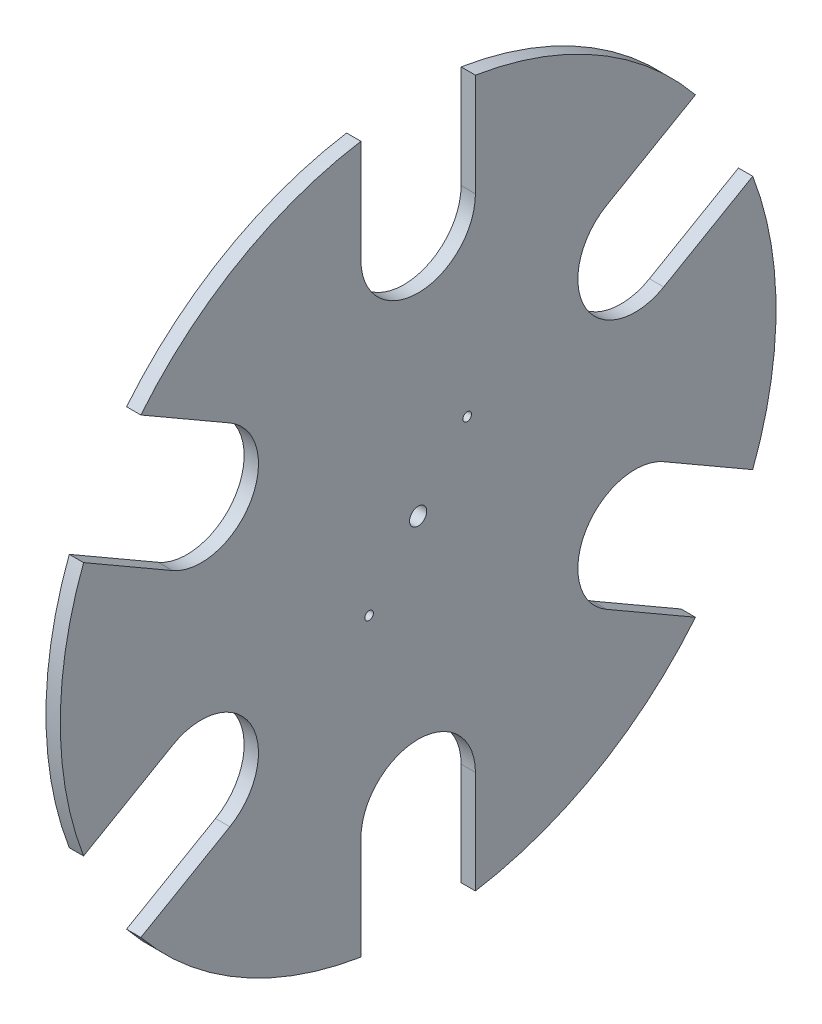
ISO-10303-21;
HEADER;
FILE_DESCRIPTION(('STEP AP214'),'2;1');
FILE_NAME('part.step','',(''),(''),'','','');
FILE_SCHEMA(('AUTOMOTIVE_DESIGN { 1 0 10303 214 1 1 1 1 }'));
ENDSEC;
DATA;
#1=APPLICATION_CONTEXT('core data for automotive mechanical design processes');
#2=APPLICATION_PROTOCOL_DEFINITION('international standard','automotive_design',2000,#1);
#3=PRODUCT_CONTEXT('',#1,'mechanical');
#4=PRODUCT('Part','Part','',(#3));
#5=PRODUCT_RELATED_PRODUCT_CATEGORY('part','',(#4));
#6=PRODUCT_DEFINITION_FORMATION('','',#4);
#7=PRODUCT_DEFINITION_CONTEXT('part definition',#1,'design');
#8=PRODUCT_DEFINITION('design','',#6,#7);
#9=PRODUCT_DEFINITION_SHAPE('','',#8);
#10=(LENGTH_UNIT() NAMED_UNIT(*) SI_UNIT(.MILLI.,.METRE.));
#11=(NAMED_UNIT(*) PLANE_ANGLE_UNIT() SI_UNIT($,.RADIAN.));
#12=(NAMED_UNIT(*) SI_UNIT($,.STERADIAN.) SOLID_ANGLE_UNIT());
#13=UNCERTAINTY_MEASURE_WITH_UNIT(LENGTH_MEASURE(1.E-05),#10,'distance_accuracy_value','');
#14=(GEOMETRIC_REPRESENTATION_CONTEXT(3) GLOBAL_UNCERTAINTY_ASSIGNED_CONTEXT((#13)) GLOBAL_UNIT_ASSIGNED_CONTEXT((#10,
#11,#12)) REPRESENTATION_CONTEXT('',''));
#15=CARTESIAN_POINT('',(0.,0.,0.));
#16=DIRECTION('',(0.,0.,1.));
#17=DIRECTION('',(1.,0.,0.));
#18=AXIS2_PLACEMENT_3D('',#15,#16,#17);
#19=CARTESIAN_POINT('',(10.,0.,0.));
#20=DIRECTION('',(-1.,0.,0.));
#21=DIRECTION('',(0.,0.,1.));
#22=AXIS2_PLACEMENT_3D('',#19,#20,#21);
#23=CYLINDRICAL_SURFACE('',#22,250.);
#24=CARTESIAN_POINT('',(0.,0.,0.));
#25=DIRECTION('',(1.,0.,0.));
#26=DIRECTION('',(0.,0.,-1.));
#27=AXIS2_PLACEMENT_3D('',#24,#25,#26);
#28=CIRCLE('',#27,250.);
#29=CARTESIAN_POINT('',(0.,-88.748610641151,-233.717102731626));
#30=VERTEX_POINT('',#29);
#31=CARTESIAN_POINT('',(0.,88.7486106411558,-233.717102731624));
#32=VERTEX_POINT('',#31);
#33=EDGE_CURVE('E226',#30,#32,#28,.T.);
#34=ORIENTED_EDGE('',*,*,#33,.T.);
#35=DIRECTION('',(-1.,0.,0.));
#36=VECTOR('',#35,1.);
#37=CARTESIAN_POINT('',(10.,88.7486106411558,-233.717102731624));
#38=LINE('',#37,#36);
#39=CARTESIAN_POINT('',(10.,88.7486106411558,-233.717102731624));
#40=VERTEX_POINT('',#39);
#41=EDGE_CURVE('E133',#40,#32,#38,.T.);
#42=ORIENTED_EDGE('',*,*,#41,.F.);
#43=CARTESIAN_POINT('',(10.,0.,0.));
#44=DIRECTION('',(1.,0.,0.));
#45=DIRECTION('',(0.,0.,-1.));
#46=AXIS2_PLACEMENT_3D('',#43,#44,#45);
#47=CIRCLE('',#46,250.);
#48=CARTESIAN_POINT('',(10.,-88.7486106411511,-233.717102731626));
#49=VERTEX_POINT('',#48);
#50=EDGE_CURVE('E417',#49,#40,#47,.T.);
#51=ORIENTED_EDGE('',*,*,#50,.F.);
#52=DIRECTION('',(-1.,0.,0.));
#53=VECTOR('',#52,1.);
#54=CARTESIAN_POINT('',(10.,-88.7486106411511,-233.717102731626));
#55=LINE('',#54,#53);
#56=EDGE_CURVE('E342',#49,#30,#55,.T.);
#57=ORIENTED_EDGE('',*,*,#56,.T.);
#58=EDGE_LOOP('',(#34,#42,#51,#57));
#59=FACE_BOUND('',#58,.T.);
#60=ADVANCED_FACE('F33',(#59),#23,.T.);
#61=CARTESIAN_POINT('',(0.,-246.779253585061,-40.0000000000017));
#62=VERTEX_POINT('',#61);
#63=CARTESIAN_POINT('',(0.,-158.030642943906,-193.717102731627));
#64=VERTEX_POINT('',#63);
#65=EDGE_CURVE('E284',#62,#64,#28,.T.);
#66=ORIENTED_EDGE('',*,*,#65,.T.);
#67=DIRECTION('',(-1.,0.,0.));
#68=VECTOR('',#67,1.);
#69=CARTESIAN_POINT('',(10.,-158.030642943906,-193.717102731627));
#70=LINE('',#69,#68);
#71=CARTESIAN_POINT('',(10.,-158.030642943906,-193.717102731627));
#72=VERTEX_POINT('',#71);
#73=EDGE_CURVE('E346',#72,#64,#70,.T.);
#74=ORIENTED_EDGE('',*,*,#73,.F.);
#75=CARTESIAN_POINT('',(10.,-246.779253585061,-40.0000000000016));
#76=VERTEX_POINT('',#75);
#77=EDGE_CURVE('E416',#76,#72,#47,.T.);
#78=ORIENTED_EDGE('',*,*,#77,.F.);
#79=DIRECTION('',(-1.,0.,0.));
#80=VECTOR('',#79,1.);
#81=CARTESIAN_POINT('',(10.,-246.779253585061,-40.0000000000016));
#82=LINE('',#81,#80);
#83=EDGE_CURVE('E172',#76,#62,#82,.T.);
#84=ORIENTED_EDGE('',*,*,#83,.T.);
#85=EDGE_LOOP('',(#66,#74,#78,#84));
#86=FACE_BOUND('',#85,.T.);
#87=ADVANCED_FACE('F452',(#86),#23,.T.);
#88=CARTESIAN_POINT('',(0.,-158.030642943909,193.717102731624));
#89=VERTEX_POINT('',#88);
#90=CARTESIAN_POINT('',(0.,-246.779253585062,39.9999999999983));
#91=VERTEX_POINT('',#90);
#92=EDGE_CURVE('E287',#89,#91,#28,.T.);
#93=ORIENTED_EDGE('',*,*,#92,.T.);
#94=DIRECTION('',(-1.,0.,0.));
#95=VECTOR('',#94,1.);
#96=CARTESIAN_POINT('',(10.,-246.779253585062,39.9999999999983));
#97=LINE('',#96,#95);
#98=CARTESIAN_POINT('',(10.,-246.779253585062,39.9999999999983));
#99=VERTEX_POINT('',#98);
#100=EDGE_CURVE('E339',#99,#91,#97,.T.);
#101=ORIENTED_EDGE('',*,*,#100,.F.);
#102=CARTESIAN_POINT('',(10.,-158.030642943909,193.717102731624));
#103=VERTEX_POINT('',#102);
#104=EDGE_CURVE('E411',#103,#99,#47,.T.);
#105=ORIENTED_EDGE('',*,*,#104,.F.);
#106=DIRECTION('',(-1.,0.,0.));
#107=VECTOR('',#106,1.);
#108=CARTESIAN_POINT('',(10.,-158.030642943909,193.717102731624));
#109=LINE('',#108,#107);
#110=EDGE_CURVE('E330',#103,#89,#109,.T.);
#111=ORIENTED_EDGE('',*,*,#110,.T.);
#112=EDGE_LOOP('',(#93,#101,#105,#111));
#113=FACE_BOUND('',#112,.T.);
#114=ADVANCED_FACE('F415',(#113),#23,.T.);
#115=CARTESIAN_POINT('',(0.,88.7486106411525,233.717102731625));
#116=VERTEX_POINT('',#115);
#117=CARTESIAN_POINT('',(0.,-88.7486106411542,233.717102731625));
#118=VERTEX_POINT('',#117);
#119=EDGE_CURVE('E225',#116,#118,#28,.T.);
#120=ORIENTED_EDGE('',*,*,#119,.T.);
#121=DIRECTION('',(-1.,0.,0.));
#122=VECTOR('',#121,1.);
#123=CARTESIAN_POINT('',(10.,-88.7486106411542,233.717102731625));
#124=LINE('',#123,#122);
#125=CARTESIAN_POINT('',(10.,-88.7486106411542,233.717102731625));
#126=VERTEX_POINT('',#125);
#127=EDGE_CURVE('E304',#126,#118,#124,.T.);
#128=ORIENTED_EDGE('',*,*,#127,.F.);
#129=CARTESIAN_POINT('',(10.,88.7486106411525,233.717102731625));
#130=VERTEX_POINT('',#129);
#131=EDGE_CURVE('E42',#130,#126,#47,.T.);
#132=ORIENTED_EDGE('',*,*,#131,.F.);
#133=DIRECTION('',(-1.,0.,0.));
#134=VECTOR('',#133,1.);
#135=CARTESIAN_POINT('',(10.,88.7486106411525,233.717102731625));
#136=LINE('',#135,#134);
#137=EDGE_CURVE('E307',#130,#116,#136,.T.);
#138=ORIENTED_EDGE('',*,*,#137,.T.);
#139=EDGE_LOOP('',(#120,#128,#132,#138));
#140=FACE_BOUND('',#139,.T.);
#141=ADVANCED_FACE('F301',(#140),#23,.T.);
#142=CARTESIAN_POINT('',(0.,246.779253585061,40.));
#143=VERTEX_POINT('',#142);
#144=CARTESIAN_POINT('',(0.,158.030642943908,193.717102731625));
#145=VERTEX_POINT('',#144);
#146=EDGE_CURVE('E222',#143,#145,#28,.T.);
#147=ORIENTED_EDGE('',*,*,#146,.T.);
#148=DIRECTION('',(-1.,0.,0.));
#149=VECTOR('',#148,1.);
#150=CARTESIAN_POINT('',(10.,158.030642943908,193.717102731625));
#151=LINE('',#150,#149);
#152=CARTESIAN_POINT('',(10.,158.030642943908,193.717102731625));
#153=VERTEX_POINT('',#152);
#154=EDGE_CURVE('E384',#153,#145,#151,.T.);
#155=ORIENTED_EDGE('',*,*,#154,.F.);
#156=CARTESIAN_POINT('',(10.,246.779253585061,40.));
#157=VERTEX_POINT('',#156);
#158=EDGE_CURVE('E11',#157,#153,#47,.T.);
#159=ORIENTED_EDGE('',*,*,#158,.F.);
#160=DIRECTION('',(-1.,0.,0.));
#161=VECTOR('',#160,1.);
#162=CARTESIAN_POINT('',(10.,246.779253585061,40.));
#163=LINE('',#162,#161);
#164=EDGE_CURVE('E359',#157,#143,#163,.T.);
#165=ORIENTED_EDGE('',*,*,#164,.T.);
#166=EDGE_LOOP('',(#147,#155,#159,#165));
#167=FACE_BOUND('',#166,.T.);
#168=ADVANCED_FACE('F436',(#167),#23,.T.);
#169=CARTESIAN_POINT('',(10.,87.5000000000089,-151.554445662282));
#170=DIRECTION('',(-1.,0.,0.));
#171=DIRECTION('',(0.,0.,1.));
#172=AXIS2_PLACEMENT_3D('',#169,#170,#171);
#173=CYLINDRICAL_SURFACE('',#172,40.);
#174=CARTESIAN_POINT('',(10.,87.5000000000089,-151.554445662282));
#175=DIRECTION('',(1.,0.,0.));
#176=DIRECTION('',(0.,0.,-1.));
#177=AXIS2_PLACEMENT_3D('',#174,#175,#176);
#178=CIRCLE('',#177,40.);
#179=CARTESIAN_POINT('',(10.,122.141016151382,-131.554445662274));
#180=VERTEX_POINT('',#179);
#181=CARTESIAN_POINT('',(10.,52.8589838486244,-171.554445662276));
#182=VERTEX_POINT('',#181);
#183=EDGE_CURVE('E208',#180,#182,#178,.T.);
#184=ORIENTED_EDGE('',*,*,#183,.T.);
#185=DIRECTION('',(-1.,0.,0.));
#186=VECTOR('',#185,1.);
#187=CARTESIAN_POINT('',(10.,52.8589838486244,-171.554445662276));
#188=LINE('',#187,#186);
#189=CARTESIAN_POINT('',(0.,52.8589838486266,-171.55444566228));
#190=VERTEX_POINT('',#189);
#191=EDGE_CURVE('E349',#182,#190,#188,.T.);
#192=ORIENTED_EDGE('',*,*,#191,.T.);
#193=CARTESIAN_POINT('',(0.,87.5000000000089,-151.554445662282));
#194=DIRECTION('',(1.,0.,0.));
#195=DIRECTION('',(0.,0.,-1.));
#196=AXIS2_PLACEMENT_3D('',#193,#194,#195);
#197=CIRCLE('',#196,40.);
#198=CARTESIAN_POINT('',(0.,122.141016151381,-131.554445662279));
#199=VERTEX_POINT('',#198);
#200=EDGE_CURVE('E207',#199,#190,#197,.T.);
#201=ORIENTED_EDGE('',*,*,#200,.F.);
#202=DIRECTION('',(-1.,0.,0.));
#203=VECTOR('',#202,1.);
#204=CARTESIAN_POINT('',(10.,122.141016151379,-131.554445662275));
#205=LINE('',#204,#203);
#206=EDGE_CURVE('E271',#180,#199,#205,.T.);
#207=ORIENTED_EDGE('',*,*,#206,.F.);
#208=EDGE_LOOP('',(#184,#192,#201,#207));
#209=FACE_BOUND('',#208,.T.);
#210=ADVANCED_FACE('F467',(#209),#173,.F.);
#211=CARTESIAN_POINT('',(10.,-87.4999999999911,-151.554445662292));
#212=DIRECTION('',(-1.,0.,0.));
#213=DIRECTION('',(0.,0.,1.));
#214=AXIS2_PLACEMENT_3D('',#211,#212,#213);
#215=CYLINDRICAL_SURFACE('',#214,40.);
#216=CARTESIAN_POINT('',(10.,-87.4999999999911,-151.554445662292));
#217=DIRECTION('',(1.,0.,0.));
#218=DIRECTION('',(0.,0.,-1.));
#219=AXIS2_PLACEMENT_3D('',#216,#217,#218);
#220=CIRCLE('',#219,40.);
#221=CARTESIAN_POINT('',(10.,-52.858983848609,-171.554445662284));
#222=VERTEX_POINT('',#221);
#223=CARTESIAN_POINT('',(10.,-122.141016151376,-131.554445662278));
#224=VERTEX_POINT('',#223);
#225=EDGE_CURVE('E198',#222,#224,#220,.T.);
#226=ORIENTED_EDGE('',*,*,#225,.T.);
#227=DIRECTION('',(-1.,0.,0.));
#228=VECTOR('',#227,1.);
#229=CARTESIAN_POINT('',(10.,-122.141016151376,-131.554445662278));
#230=LINE('',#229,#228);
#231=CARTESIAN_POINT('',(0.,-122.141016151379,-131.554445662282));
#232=VERTEX_POINT('',#231);
#233=EDGE_CURVE('E178',#224,#232,#230,.T.);
#234=ORIENTED_EDGE('',*,*,#233,.T.);
#235=CARTESIAN_POINT('',(0.,-87.4999999999911,-151.554445662292));
#236=DIRECTION('',(1.,0.,0.));
#237=DIRECTION('',(0.,0.,-1.));
#238=AXIS2_PLACEMENT_3D('',#235,#236,#237);
#239=CIRCLE('',#238,40.);
#240=CARTESIAN_POINT('',(0.,-52.8589838486231,-171.554445662281));
#241=VERTEX_POINT('',#240);
#242=EDGE_CURVE('E195',#241,#232,#239,.T.);
#243=ORIENTED_EDGE('',*,*,#242,.F.);
#244=DIRECTION('',(-1.,0.,0.));
#245=VECTOR('',#244,1.);
#246=CARTESIAN_POINT('',(10.,-52.8589838486209,-171.554445662277));
#247=LINE('',#246,#245);
#248=EDGE_CURVE('E340',#222,#241,#247,.T.);
#249=ORIENTED_EDGE('',*,*,#248,.F.);
#250=EDGE_LOOP('',(#226,#234,#243,#249));
#251=FACE_BOUND('',#250,.T.);
#252=ADVANCED_FACE('F472',(#251),#215,.F.);
#253=CARTESIAN_POINT('',(10.,-175.,-2.0418931181722E-11));
#254=DIRECTION('',(-1.,0.,0.));
#255=DIRECTION('',(0.,0.,1.));
#256=AXIS2_PLACEMENT_3D('',#253,#254,#255);
#257=CYLINDRICAL_SURFACE('',#256,40.);
#258=CARTESIAN_POINT('',(10.,-175.,-2.0418931181722E-11));
#259=DIRECTION('',(1.,0.,0.));
#260=DIRECTION('',(0.,0.,-1.));
#261=AXIS2_PLACEMENT_3D('',#258,#259,#260);
#262=CIRCLE('',#261,40.);
#263=CARTESIAN_POINT('',(10.,-175.,-40.0000000000204));
#264=VERTEX_POINT('',#263);
#265=CARTESIAN_POINT('',(10.,-175.,39.9999999999988));
#266=VERTEX_POINT('',#265);
#267=EDGE_CURVE('E185',#264,#266,#262,.T.);
#268=ORIENTED_EDGE('',*,*,#267,.T.);
#269=DIRECTION('',(-1.,0.,0.));
#270=VECTOR('',#269,1.);
#271=CARTESIAN_POINT('',(10.,-175.,39.9999999999988));
#272=LINE('',#271,#270);
#273=CARTESIAN_POINT('',(0.,-175.,39.9999999999988));
#274=VERTEX_POINT('',#273);
#275=EDGE_CURVE('E336',#266,#274,#272,.T.);
#276=ORIENTED_EDGE('',*,*,#275,.T.);
#277=CARTESIAN_POINT('',(0.,-175.,-2.0418931181722E-11));
#278=DIRECTION('',(1.,0.,0.));
#279=DIRECTION('',(0.,0.,-1.));
#280=AXIS2_PLACEMENT_3D('',#277,#278,#279);
#281=CIRCLE('',#280,40.);
#282=CARTESIAN_POINT('',(0.,-175.,-40.0000000000013));
#283=VERTEX_POINT('',#282);
#284=EDGE_CURVE('E187',#283,#274,#281,.T.);
#285=ORIENTED_EDGE('',*,*,#284,.F.);
#286=DIRECTION('',(-1.,0.,0.));
#287=VECTOR('',#286,1.);
#288=CARTESIAN_POINT('',(10.,-175.,-40.0000000000013));
#289=LINE('',#288,#287);
#290=EDGE_CURVE('E169',#264,#283,#289,.T.);
#291=ORIENTED_EDGE('',*,*,#290,.F.);
#292=EDGE_LOOP('',(#268,#276,#285,#291));
#293=FACE_BOUND('',#292,.T.);
#294=ADVANCED_FACE('F183',(#293),#257,.F.);
#295=CARTESIAN_POINT('',(10.,-87.5000000000089,151.554445662261));
#296=DIRECTION('',(-1.,0.,0.));
#297=DIRECTION('',(0.,0.,1.));
#298=AXIS2_PLACEMENT_3D('',#295,#296,#297);
#299=CYLINDRICAL_SURFACE('',#298,40.);
#300=CARTESIAN_POINT('',(10.,-87.5000000000089,151.554445662261));
#301=DIRECTION('',(1.,0.,0.));
#302=DIRECTION('',(0.,0.,-1.));
#303=AXIS2_PLACEMENT_3D('',#300,#301,#302);
#304=CIRCLE('',#303,40.);
#305=CARTESIAN_POINT('',(10.,-122.141016151391,131.554445662269));
#306=VERTEX_POINT('',#305);
#307=CARTESIAN_POINT('',(10.,-52.8589838486232,171.554445662277));
#308=VERTEX_POINT('',#307);
#309=EDGE_CURVE('E200',#306,#308,#304,.T.);
#310=ORIENTED_EDGE('',*,*,#309,.T.);
#311=DIRECTION('',(-1.,0.,0.));
#312=VECTOR('',#311,1.);
#313=CARTESIAN_POINT('',(10.,-52.8589838486232,171.554445662277));
#314=LINE('',#313,#312);
#315=CARTESIAN_POINT('',(0.,-52.858983848621,171.554445662273));
#316=VERTEX_POINT('',#315);
#317=EDGE_CURVE('E318',#308,#316,#314,.T.);
#318=ORIENTED_EDGE('',*,*,#317,.T.);
#319=CARTESIAN_POINT('',(0.,-87.5000000000089,151.554445662261));
#320=DIRECTION('',(1.,0.,0.));
#321=DIRECTION('',(0.,0.,-1.));
#322=AXIS2_PLACEMENT_3D('',#319,#320,#321);
#323=CIRCLE('',#322,40.);
#324=CARTESIAN_POINT('',(0.,-122.141016151376,131.554445662272));
#325=VERTEX_POINT('',#324);
#326=EDGE_CURVE('E238',#325,#316,#323,.T.);
#327=ORIENTED_EDGE('',*,*,#326,.F.);
#328=DIRECTION('',(-1.,0.,0.));
#329=VECTOR('',#328,1.);
#330=CARTESIAN_POINT('',(10.,-122.141016151378,131.554445662276));
#331=LINE('',#330,#329);
#332=EDGE_CURVE('E333',#306,#325,#331,.T.);
#333=ORIENTED_EDGE('',*,*,#332,.F.);
#334=EDGE_LOOP('',(#310,#318,#327,#333));
#335=FACE_BOUND('',#334,.T.);
#336=ADVANCED_FACE('F322',(#335),#299,.F.);
#337=CARTESIAN_POINT('',(10.,87.499999999991,151.554445662272));
#338=DIRECTION('',(-1.,0.,0.));
#339=DIRECTION('',(0.,0.,1.));
#340=AXIS2_PLACEMENT_3D('',#337,#338,#339);
#341=CYLINDRICAL_SURFACE('',#340,40.);
#342=CARTESIAN_POINT('',(10.,87.499999999991,151.554445662272));
#343=DIRECTION('',(1.,0.,0.));
#344=DIRECTION('',(0.,0.,-1.));
#345=AXIS2_PLACEMENT_3D('',#342,#343,#344);
#346=CIRCLE('',#345,40.);
#347=CARTESIAN_POINT('',(10.,52.8589838486179,171.554445662279));
#348=VERTEX_POINT('',#347);
#349=CARTESIAN_POINT('',(10.,122.141016151377,131.554445662277));
#350=VERTEX_POINT('',#349);
#351=EDGE_CURVE('E237',#348,#350,#346,.T.);
#352=ORIENTED_EDGE('',*,*,#351,.T.);
#353=DIRECTION('',(-1.,0.,0.));
#354=VECTOR('',#353,1.);
#355=CARTESIAN_POINT('',(10.,122.141016151377,131.554445662277));
#356=LINE('',#355,#354);
#357=CARTESIAN_POINT('',(0.,122.141016151375,131.554445662273));
#358=VERTEX_POINT('',#357);
#359=EDGE_CURVE('E371',#350,#358,#356,.T.);
#360=ORIENTED_EDGE('',*,*,#359,.T.);
#361=CARTESIAN_POINT('',(0.,87.499999999991,151.554445662272));
#362=DIRECTION('',(1.,0.,0.));
#363=DIRECTION('',(0.,0.,-1.));
#364=AXIS2_PLACEMENT_3D('',#361,#362,#363);
#365=CIRCLE('',#364,40.);
#366=CARTESIAN_POINT('',(0.,52.8589838486198,171.554445662273));
#367=VERTEX_POINT('',#366);
#368=EDGE_CURVE('E234',#367,#358,#365,.T.);
#369=ORIENTED_EDGE('',*,*,#368,.F.);
#370=DIRECTION('',(-1.,0.,0.));
#371=VECTOR('',#370,1.);
#372=CARTESIAN_POINT('',(10.,52.858983848622,171.554445662277));
#373=LINE('',#372,#371);
#374=EDGE_CURVE('E372',#348,#367,#373,.T.);
#375=ORIENTED_EDGE('',*,*,#374,.F.);
#376=EDGE_LOOP('',(#352,#360,#369,#375));
#377=FACE_BOUND('',#376,.T.);
#378=ADVANCED_FACE('F369',(#377),#341,.F.);
#379=CARTESIAN_POINT('',(10.,175.,0.));
#380=DIRECTION('',(-1.,0.,0.));
#381=DIRECTION('',(0.,0.,1.));
#382=AXIS2_PLACEMENT_3D('',#379,#380,#381);
#383=CYLINDRICAL_SURFACE('',#382,40.);
#384=CARTESIAN_POINT('',(10.,175.,0.));
#385=DIRECTION('',(1.,0.,0.));
#386=DIRECTION('',(0.,0.,-1.));
#387=AXIS2_PLACEMENT_3D('',#384,#385,#386);
#388=CIRCLE('',#387,40.);
#389=CARTESIAN_POINT('',(10.,175.,40.));
#390=VERTEX_POINT('',#389);
#391=CARTESIAN_POINT('',(10.,175.,-40.));
#392=VERTEX_POINT('',#391);
#393=EDGE_CURVE('E212',#390,#392,#388,.T.);
#394=ORIENTED_EDGE('',*,*,#393,.T.);
#395=DIRECTION('',(-1.,0.,0.));
#396=VECTOR('',#395,1.);
#397=CARTESIAN_POINT('',(10.,175.,-40.));
#398=LINE('',#397,#396);
#399=CARTESIAN_POINT('',(0.,175.,-40.));
#400=VERTEX_POINT('',#399);
#401=EDGE_CURVE('E232',#392,#400,#398,.T.);
#402=ORIENTED_EDGE('',*,*,#401,.T.);
#403=CARTESIAN_POINT('',(0.,175.,0.));
#404=DIRECTION('',(1.,0.,0.));
#405=DIRECTION('',(0.,0.,-1.));
#406=AXIS2_PLACEMENT_3D('',#403,#404,#405);
#407=CIRCLE('',#406,40.);
#408=CARTESIAN_POINT('',(0.,175.,40.));
#409=VERTEX_POINT('',#408);
#410=EDGE_CURVE('E211',#409,#400,#407,.T.);
#411=ORIENTED_EDGE('',*,*,#410,.F.);
#412=DIRECTION('',(-1.,0.,0.));
#413=VECTOR('',#412,1.);
#414=CARTESIAN_POINT('',(10.,175.,40.));
#415=LINE('',#414,#413);
#416=EDGE_CURVE('E141',#390,#409,#415,.T.);
#417=ORIENTED_EDGE('',*,*,#416,.F.);
#418=EDGE_LOOP('',(#394,#402,#411,#417));
#419=FACE_BOUND('',#418,.T.);
#420=ADVANCED_FACE('F431',(#419),#383,.F.);
#421=CARTESIAN_POINT('',(10.,0.,0.));
#422=DIRECTION('',(1.,0.,0.));
#423=DIRECTION('',(0.,0.,-1.));
#424=AXIS2_PLACEMENT_3D('',#421,#422,#423);
#425=PLANE('',#424);
#426=DIRECTION('',(0.,-0.50000000000001,0.866025403784433));
#427=VECTOR('',#426,1.);
#428=CARTESIAN_POINT('',(10.,52.8589838486244,-171.554445662276));
#429=LINE('',#428,#427);
#430=EDGE_CURVE('E348',#40,#182,#429,.T.);
#431=ORIENTED_EDGE('',*,*,#430,.T.);
#432=ORIENTED_EDGE('',*,*,#183,.F.);
#433=DIRECTION('',(0.,0.50000000000001,-0.866025403784433));
#434=VECTOR('',#433,1.);
#435=CARTESIAN_POINT('',(10.,122.141016151379,-131.554445662275));
#436=LINE('',#435,#434);
#437=CARTESIAN_POINT('',(10.,158.03064294391,-193.717102731623));
#438=VERTEX_POINT('',#437);
#439=EDGE_CURVE('E59',#180,#438,#436,.T.);
#440=ORIENTED_EDGE('',*,*,#439,.T.);
#441=CARTESIAN_POINT('',(10.,246.779253585061,-40.));
#442=VERTEX_POINT('',#441);
#443=EDGE_CURVE('E44',#438,#442,#47,.T.);
#444=ORIENTED_EDGE('',*,*,#443,.T.);
#445=DIRECTION('',(0.,-1.,0.));
#446=VECTOR('',#445,1.);
#447=CARTESIAN_POINT('',(10.,175.,-40.));
#448=LINE('',#447,#446);
#449=EDGE_CURVE('E354',#442,#392,#448,.T.);
#450=ORIENTED_EDGE('',*,*,#449,.T.);
#451=ORIENTED_EDGE('',*,*,#393,.F.);
#452=DIRECTION('',(0.,1.,0.));
#453=VECTOR('',#452,1.);
#454=CARTESIAN_POINT('',(10.,175.,40.));
#455=LINE('',#454,#453);
#456=EDGE_CURVE('E249',#390,#157,#455,.T.);
#457=ORIENTED_EDGE('',*,*,#456,.T.);
#458=ORIENTED_EDGE('',*,*,#158,.T.);
#459=DIRECTION('',(0.,-0.499999999999998,-0.86602540378444));
#460=VECTOR('',#459,1.);
#461=CARTESIAN_POINT('',(10.,122.141016151377,131.554445662277));
#462=LINE('',#461,#460);
#463=EDGE_CURVE('E328',#153,#350,#462,.T.);
#464=ORIENTED_EDGE('',*,*,#463,.T.);
#465=ORIENTED_EDGE('',*,*,#351,.F.);
#466=DIRECTION('',(0.,0.499999999999998,0.86602540378444));
#467=VECTOR('',#466,1.);
#468=CARTESIAN_POINT('',(10.,52.858983848622,171.554445662277));
#469=LINE('',#468,#467);
#470=EDGE_CURVE('E325',#348,#130,#469,.T.);
#471=ORIENTED_EDGE('',*,*,#470,.T.);
#472=ORIENTED_EDGE('',*,*,#131,.T.);
#473=DIRECTION('',(0.,0.500000000000004,-0.866025403784436));
#474=VECTOR('',#473,1.);
#475=CARTESIAN_POINT('',(10.,-52.8589838486232,171.554445662277));
#476=LINE('',#475,#474);
#477=EDGE_CURVE('E406',#126,#308,#476,.T.);
#478=ORIENTED_EDGE('',*,*,#477,.T.);
#479=ORIENTED_EDGE('',*,*,#309,.F.);
#480=DIRECTION('',(0.,-0.500000000000004,0.866025403784436));
#481=VECTOR('',#480,1.);
#482=CARTESIAN_POINT('',(10.,-122.141016151378,131.554445662276));
#483=LINE('',#482,#481);
#484=EDGE_CURVE('E338',#306,#103,#483,.T.);
#485=ORIENTED_EDGE('',*,*,#484,.T.);
#486=ORIENTED_EDGE('',*,*,#104,.T.);
#487=DIRECTION('',(0.,1.,0.));
#488=VECTOR('',#487,1.);
#489=CARTESIAN_POINT('',(10.,-175.,39.9999999999988));
#490=LINE('',#489,#488);
#491=EDGE_CURVE('E177',#99,#266,#490,.T.);
#492=ORIENTED_EDGE('',*,*,#491,.T.);
#493=ORIENTED_EDGE('',*,*,#267,.F.);
#494=DIRECTION('',(0.,-1.,0.));
#495=VECTOR('',#494,1.);
#496=CARTESIAN_POINT('',(10.,-175.,-40.0000000000013));
#497=LINE('',#496,#495);
#498=EDGE_CURVE('E166',#264,#76,#497,.T.);
#499=ORIENTED_EDGE('',*,*,#498,.T.);
#500=ORIENTED_EDGE('',*,*,#77,.T.);
#501=DIRECTION('',(0.,0.499999999999992,0.866025403784443));
#502=VECTOR('',#501,1.);
#503=CARTESIAN_POINT('',(10.,-122.141016151376,-131.554445662278));
#504=LINE('',#503,#502);
#505=EDGE_CURVE('E343',#72,#224,#504,.T.);
#506=ORIENTED_EDGE('',*,*,#505,.T.);
#507=ORIENTED_EDGE('',*,*,#225,.F.);
#508=DIRECTION('',(0.,-0.499999999999992,-0.866025403784443));
#509=VECTOR('',#508,1.);
#510=CARTESIAN_POINT('',(10.,-52.8589838486209,-171.554445662277));
#511=LINE('',#510,#509);
#512=EDGE_CURVE('E351',#222,#49,#511,.T.);
#513=ORIENTED_EDGE('',*,*,#512,.T.);
#514=ORIENTED_EDGE('',*,*,#50,.T.);
#515=EDGE_LOOP('',(#431,#432,#440,#444,#450,#451,#457,#458,#464,#465,#471,#472,#478,#479,#485,
#486,#492,#493,#499,#500,#506,#507,#513,#514));
#516=FACE_BOUND('',#515,.T.);
#517=CARTESIAN_POINT('',(10.,-43.035173342288,34.2487058937885));
#518=DIRECTION('',(-1.,0.,0.));
#519=DIRECTION('',(0.,0.,1.));
#520=AXIS2_PLACEMENT_3D('',#517,#518,#519);
#521=CIRCLE('',#520,3.);
#522=CARTESIAN_POINT('',(10.,-43.035173342288,37.2487058937885));
#523=VERTEX_POINT('',#522);
#524=EDGE_CURVE('E386',#523,#523,#521,.T.);
#525=ORIENTED_EDGE('',*,*,#524,.T.);
#526=EDGE_LOOP('',(#525));
#527=FACE_BOUND('',#526,.T.);
#528=CARTESIAN_POINT('',(10.,43.035173342288,-34.2487058937885));
#529=DIRECTION('',(-1.,0.,0.));
#530=DIRECTION('',(0.,0.,1.));
#531=AXIS2_PLACEMENT_3D('',#528,#529,#530);
#532=CIRCLE('',#531,2.99999999999999);
#533=CARTESIAN_POINT('',(10.,43.035173342288,-31.2487058937885));
#534=VERTEX_POINT('',#533);
#535=EDGE_CURVE('E253',#534,#534,#532,.T.);
#536=ORIENTED_EDGE('',*,*,#535,.T.);
#537=EDGE_LOOP('',(#536));
#538=FACE_BOUND('',#537,.T.);
#539=CARTESIAN_POINT('',(10.,0.,0.));
#540=DIRECTION('',(1.,0.,0.));
#541=DIRECTION('',(0.,0.,-1.));
#542=AXIS2_PLACEMENT_3D('',#539,#540,#541);
#543=CIRCLE('',#542,6.);
#544=CARTESIAN_POINT('',(10.,0.,-6.));
#545=VERTEX_POINT('',#544);
#546=EDGE_CURVE('E216',#545,#545,#543,.T.);
#547=ORIENTED_EDGE('',*,*,#546,.F.);
#548=EDGE_LOOP('',(#547));
#549=FACE_BOUND('',#548,.T.);
#550=ADVANCED_FACE('F191',(#516,#527,#538,#549),#425,.T.);
#551=CARTESIAN_POINT('',(0.,0.,0.));
#552=DIRECTION('',(1.,0.,0.));
#553=DIRECTION('',(0.,0.,-1.));
#554=AXIS2_PLACEMENT_3D('',#551,#552,#553);
#555=PLANE('',#554);
#556=CARTESIAN_POINT('',(0.,-43.035173342288,34.2487058937885));
#557=DIRECTION('',(1.,0.,0.));
#558=DIRECTION('',(0.,0.,-1.));
#559=AXIS2_PLACEMENT_3D('',#556,#557,#558);
#560=CIRCLE('',#559,3.);
#561=CARTESIAN_POINT('',(0.,-43.035173342288,31.2487058937885));
#562=VERTEX_POINT('',#561);
#563=EDGE_CURVE('E246',#562,#562,#560,.T.);
#564=ORIENTED_EDGE('',*,*,#563,.T.);
#565=EDGE_LOOP('',(#564));
#566=FACE_BOUND('',#565,.T.);
#567=CARTESIAN_POINT('',(0.,43.035173342288,-34.2487058937885));
#568=DIRECTION('',(1.,0.,0.));
#569=DIRECTION('',(0.,0.,-1.));
#570=AXIS2_PLACEMENT_3D('',#567,#568,#569);
#571=CIRCLE('',#570,2.99999999999999);
#572=CARTESIAN_POINT('',(0.,43.035173342288,-37.2487058937885));
#573=VERTEX_POINT('',#572);
#574=EDGE_CURVE('E243',#573,#573,#571,.T.);
#575=ORIENTED_EDGE('',*,*,#574,.T.);
#576=EDGE_LOOP('',(#575));
#577=FACE_BOUND('',#576,.T.);
#578=ORIENTED_EDGE('',*,*,#200,.T.);
#579=DIRECTION('',(0.,0.50000000000001,-0.866025403784433));
#580=VECTOR('',#579,1.);
#581=CARTESIAN_POINT('',(0.,52.8589838486244,-171.554445662276));
#582=LINE('',#581,#580);
#583=EDGE_CURVE('E37',#32,#190,#582,.F.);
#584=ORIENTED_EDGE('',*,*,#583,.F.);
#585=ORIENTED_EDGE('',*,*,#33,.F.);
#586=DIRECTION('',(0.,0.499999999999992,0.866025403784443));
#587=VECTOR('',#586,1.);
#588=CARTESIAN_POINT('',(0.,-52.8589838486209,-171.554445662277));
#589=LINE('',#588,#587);
#590=EDGE_CURVE('E263',#241,#30,#589,.F.);
#591=ORIENTED_EDGE('',*,*,#590,.F.);
#592=ORIENTED_EDGE('',*,*,#242,.T.);
#593=DIRECTION('',(0.,-0.499999999999992,-0.866025403784443));
#594=VECTOR('',#593,1.);
#595=CARTESIAN_POINT('',(0.,-122.141016151376,-131.554445662278));
#596=LINE('',#595,#594);
#597=EDGE_CURVE('E265',#64,#232,#596,.F.);
#598=ORIENTED_EDGE('',*,*,#597,.F.);
#599=ORIENTED_EDGE('',*,*,#65,.F.);
#600=DIRECTION('',(0.,1.,0.));
#601=VECTOR('',#600,1.);
#602=CARTESIAN_POINT('',(0.,-175.,-40.0000000000013));
#603=LINE('',#602,#601);
#604=EDGE_CURVE('E259',#283,#62,#603,.F.);
#605=ORIENTED_EDGE('',*,*,#604,.F.);
#606=ORIENTED_EDGE('',*,*,#284,.T.);
#607=DIRECTION('',(0.,-1.,0.));
#608=VECTOR('',#607,1.);
#609=CARTESIAN_POINT('',(0.,-175.,39.9999999999988));
#610=LINE('',#609,#608);
#611=EDGE_CURVE('E261',#91,#274,#610,.F.);
#612=ORIENTED_EDGE('',*,*,#611,.F.);
#613=ORIENTED_EDGE('',*,*,#92,.F.);
#614=DIRECTION('',(0.,0.500000000000004,-0.866025403784437));
#615=VECTOR('',#614,1.);
#616=CARTESIAN_POINT('',(0.,-122.141016151378,131.554445662276));
#617=LINE('',#616,#615);
#618=EDGE_CURVE('E255',#325,#89,#617,.F.);
#619=ORIENTED_EDGE('',*,*,#618,.F.);
#620=ORIENTED_EDGE('',*,*,#326,.T.);
#621=DIRECTION('',(0.,-0.500000000000004,0.866025403784436));
#622=VECTOR('',#621,1.);
#623=CARTESIAN_POINT('',(0.,-52.8589838486232,171.554445662277));
#624=LINE('',#623,#622);
#625=EDGE_CURVE('E257',#118,#316,#624,.F.);
#626=ORIENTED_EDGE('',*,*,#625,.F.);
#627=ORIENTED_EDGE('',*,*,#119,.F.);
#628=DIRECTION('',(0.,-0.499999999999998,-0.86602540378444));
#629=VECTOR('',#628,1.);
#630=CARTESIAN_POINT('',(0.,52.858983848622,171.554445662277));
#631=LINE('',#630,#629);
#632=EDGE_CURVE('E250',#367,#116,#631,.F.);
#633=ORIENTED_EDGE('',*,*,#632,.F.);
#634=ORIENTED_EDGE('',*,*,#368,.T.);
#635=DIRECTION('',(0.,0.499999999999998,0.86602540378444));
#636=VECTOR('',#635,1.);
#637=CARTESIAN_POINT('',(0.,122.141016151377,131.554445662277));
#638=LINE('',#637,#636);
#639=EDGE_CURVE('E252',#145,#358,#638,.F.);
#640=ORIENTED_EDGE('',*,*,#639,.F.);
#641=ORIENTED_EDGE('',*,*,#146,.F.);
#642=DIRECTION('',(0.,1.,0.));
#643=VECTOR('',#642,1.);
#644=CARTESIAN_POINT('',(0.,175.,40.));
#645=LINE('',#644,#643);
#646=EDGE_CURVE('E229',#409,#143,#645,.T.);
#647=ORIENTED_EDGE('',*,*,#646,.F.);
#648=ORIENTED_EDGE('',*,*,#410,.T.);
#649=DIRECTION('',(0.,1.,0.));
#650=VECTOR('',#649,1.);
#651=CARTESIAN_POINT('',(0.,175.,-40.));
#652=LINE('',#651,#650);
#653=CARTESIAN_POINT('',(0.,246.779253585061,-40.));
#654=VERTEX_POINT('',#653);
#655=EDGE_CURVE('E231',#654,#400,#652,.F.);
#656=ORIENTED_EDGE('',*,*,#655,.F.);
#657=CARTESIAN_POINT('',(0.,158.03064294391,-193.717102731623));
#658=VERTEX_POINT('',#657);
#659=EDGE_CURVE('E219',#658,#654,#28,.T.);
#660=ORIENTED_EDGE('',*,*,#659,.F.);
#661=DIRECTION('',(0.,-0.50000000000001,0.866025403784433));
#662=VECTOR('',#661,1.);
#663=CARTESIAN_POINT('',(0.,122.141016151379,-131.554445662275));
#664=LINE('',#663,#662);
#665=EDGE_CURVE('E266',#199,#658,#664,.F.);
#666=ORIENTED_EDGE('',*,*,#665,.F.);
#667=EDGE_LOOP('',(#578,#584,#585,#591,#592,#598,#599,#605,#606,#612,#613,#619,#620,#626,#627,
#633,#634,#640,#641,#647,#648,#656,#660,#666));
#668=FACE_BOUND('',#667,.T.);
#669=CARTESIAN_POINT('',(0.,0.,0.));
#670=DIRECTION('',(1.,0.,0.));
#671=DIRECTION('',(0.,0.,-1.));
#672=AXIS2_PLACEMENT_3D('',#669,#670,#671);
#673=CIRCLE('',#672,6.);
#674=CARTESIAN_POINT('',(0.,0.,-6.));
#675=VERTEX_POINT('',#674);
#676=EDGE_CURVE('E215',#675,#675,#673,.T.);
#677=ORIENTED_EDGE('',*,*,#676,.T.);
#678=EDGE_LOOP('',(#677));
#679=FACE_BOUND('',#678,.T.);
#680=ADVANCED_FACE('F282',(#566,#577,#668,#679),#555,.F.);
#681=ORIENTED_EDGE('',*,*,#443,.F.);
#682=DIRECTION('',(-1.,0.,0.));
#683=VECTOR('',#682,1.);
#684=CARTESIAN_POINT('',(10.,158.03064294391,-193.717102731623));
#685=LINE('',#684,#683);
#686=EDGE_CURVE('E270',#438,#658,#685,.T.);
#687=ORIENTED_EDGE('',*,*,#686,.T.);
#688=ORIENTED_EDGE('',*,*,#659,.T.);
#689=DIRECTION('',(-1.,0.,0.));
#690=VECTOR('',#689,1.);
#691=CARTESIAN_POINT('',(10.,246.779253585061,-40.));
#692=LINE('',#691,#690);
#693=EDGE_CURVE('E357',#442,#654,#692,.T.);
#694=ORIENTED_EDGE('',*,*,#693,.F.);
#695=EDGE_LOOP('',(#681,#687,#688,#694));
#696=FACE_BOUND('',#695,.T.);
#697=ADVANCED_FACE('F35',(#696),#23,.T.);
#698=CARTESIAN_POINT('',(10.,0.,0.));
#699=DIRECTION('',(-1.,0.,0.));
#700=DIRECTION('',(0.,0.,1.));
#701=AXIS2_PLACEMENT_3D('',#698,#699,#700);
#702=CYLINDRICAL_SURFACE('',#701,6.);
#703=ORIENTED_EDGE('',*,*,#546,.T.);
#704=EDGE_LOOP('',(#703));
#705=FACE_BOUND('',#704,.T.);
#706=ORIENTED_EDGE('',*,*,#676,.F.);
#707=EDGE_LOOP('',(#706));
#708=FACE_BOUND('',#707,.T.);
#709=ADVANCED_FACE('F458',(#705,#708),#702,.F.);
#710=CARTESIAN_POINT('',(10.,175.,40.));
#711=DIRECTION('',(0.,0.,1.));
#712=DIRECTION('',(1.,0.,0.));
#713=AXIS2_PLACEMENT_3D('',#710,#711,#712);
#714=PLANE('',#713);
#715=ORIENTED_EDGE('',*,*,#164,.F.);
#716=ORIENTED_EDGE('',*,*,#456,.F.);
#717=ORIENTED_EDGE('',*,*,#416,.T.);
#718=ORIENTED_EDGE('',*,*,#646,.T.);
#719=EDGE_LOOP('',(#715,#716,#717,#718));
#720=FACE_BOUND('',#719,.T.);
#721=ADVANCED_FACE('F434',(#720),#714,.F.);
#722=CARTESIAN_POINT('',(10.,175.,-40.));
#723=DIRECTION('',(0.,0.,-1.));
#724=DIRECTION('',(-1.,0.,0.));
#725=AXIS2_PLACEMENT_3D('',#722,#723,#724);
#726=PLANE('',#725);
#727=ORIENTED_EDGE('',*,*,#401,.F.);
#728=ORIENTED_EDGE('',*,*,#449,.F.);
#729=ORIENTED_EDGE('',*,*,#693,.T.);
#730=ORIENTED_EDGE('',*,*,#655,.T.);
#731=EDGE_LOOP('',(#727,#728,#729,#730));
#732=FACE_BOUND('',#731,.T.);
#733=ADVANCED_FACE('F428',(#732),#726,.F.);
#734=CARTESIAN_POINT('',(10.,52.858983848622,171.554445662277));
#735=DIRECTION('',(0.,-0.86602540378444,0.499999999999998));
#736=DIRECTION('',(0.,-0.499999999999998,-0.86602540378444));
#737=AXIS2_PLACEMENT_3D('',#734,#735,#736);
#738=PLANE('',#737);
#739=ORIENTED_EDGE('',*,*,#137,.F.);
#740=ORIENTED_EDGE('',*,*,#470,.F.);
#741=ORIENTED_EDGE('',*,*,#374,.T.);
#742=ORIENTED_EDGE('',*,*,#632,.T.);
#743=EDGE_LOOP('',(#739,#740,#741,#742));
#744=FACE_BOUND('',#743,.T.);
#745=ADVANCED_FACE('F441',(#744),#738,.F.);
#746=CARTESIAN_POINT('',(10.,122.141016151377,131.554445662277));
#747=DIRECTION('',(0.,0.86602540378444,-0.499999999999998));
#748=DIRECTION('',(0.,0.499999999999998,0.86602540378444));
#749=AXIS2_PLACEMENT_3D('',#746,#747,#748);
#750=PLANE('',#749);
#751=ORIENTED_EDGE('',*,*,#359,.F.);
#752=ORIENTED_EDGE('',*,*,#463,.F.);
#753=ORIENTED_EDGE('',*,*,#154,.T.);
#754=ORIENTED_EDGE('',*,*,#639,.T.);
#755=EDGE_LOOP('',(#751,#752,#753,#754));
#756=FACE_BOUND('',#755,.T.);
#757=ADVANCED_FACE('F438',(#756),#750,.F.);
#758=CARTESIAN_POINT('',(10.,-122.141016151378,131.554445662276));
#759=DIRECTION('',(0.,-0.866025403784437,-0.500000000000004));
#760=DIRECTION('',(0.,0.500000000000004,-0.866025403784437));
#761=AXIS2_PLACEMENT_3D('',#758,#759,#760);
#762=PLANE('',#761);
#763=ORIENTED_EDGE('',*,*,#110,.F.);
#764=ORIENTED_EDGE('',*,*,#484,.F.);
#765=ORIENTED_EDGE('',*,*,#332,.T.);
#766=ORIENTED_EDGE('',*,*,#618,.T.);
#767=EDGE_LOOP('',(#763,#764,#765,#766));
#768=FACE_BOUND('',#767,.T.);
#769=ADVANCED_FACE('F440',(#768),#762,.F.);
#770=CARTESIAN_POINT('',(10.,-52.8589838486232,171.554445662277));
#771=DIRECTION('',(0.,0.866025403784436,0.500000000000004));
#772=DIRECTION('',(0.,-0.500000000000004,0.866025403784436));
#773=AXIS2_PLACEMENT_3D('',#770,#771,#772);
#774=PLANE('',#773);
#775=ORIENTED_EDGE('',*,*,#317,.F.);
#776=ORIENTED_EDGE('',*,*,#477,.F.);
#777=ORIENTED_EDGE('',*,*,#127,.T.);
#778=ORIENTED_EDGE('',*,*,#625,.T.);
#779=EDGE_LOOP('',(#775,#776,#777,#778));
#780=FACE_BOUND('',#779,.T.);
#781=ADVANCED_FACE('F316',(#780),#774,.F.);
#782=CARTESIAN_POINT('',(10.,-175.,-40.0000000000013));
#783=DIRECTION('',(0.,0.,-1.));
#784=DIRECTION('',(0.,1.,0.));
#785=AXIS2_PLACEMENT_3D('',#782,#783,#784);
#786=PLANE('',#785);
#787=ORIENTED_EDGE('',*,*,#83,.F.);
#788=ORIENTED_EDGE('',*,*,#498,.F.);
#789=ORIENTED_EDGE('',*,*,#290,.T.);
#790=ORIENTED_EDGE('',*,*,#604,.T.);
#791=EDGE_LOOP('',(#787,#788,#789,#790));
#792=FACE_BOUND('',#791,.T.);
#793=ADVANCED_FACE('F168',(#792),#786,.F.);
#794=CARTESIAN_POINT('',(10.,-175.,39.9999999999988));
#795=DIRECTION('',(0.,0.,1.));
#796=DIRECTION('',(0.,-1.,0.));
#797=AXIS2_PLACEMENT_3D('',#794,#795,#796);
#798=PLANE('',#797);
#799=ORIENTED_EDGE('',*,*,#275,.F.);
#800=ORIENTED_EDGE('',*,*,#491,.F.);
#801=ORIENTED_EDGE('',*,*,#100,.T.);
#802=ORIENTED_EDGE('',*,*,#611,.T.);
#803=EDGE_LOOP('',(#799,#800,#801,#802));
#804=FACE_BOUND('',#803,.T.);
#805=ADVANCED_FACE('F541',(#804),#798,.F.);
#806=CARTESIAN_POINT('',(10.,-52.8589838486209,-171.554445662277));
#807=DIRECTION('',(0.,0.866025403784443,-0.499999999999992));
#808=DIRECTION('',(0.,0.499999999999992,0.866025403784443));
#809=AXIS2_PLACEMENT_3D('',#806,#807,#808);
#810=PLANE('',#809);
#811=ORIENTED_EDGE('',*,*,#56,.F.);
#812=ORIENTED_EDGE('',*,*,#512,.F.);
#813=ORIENTED_EDGE('',*,*,#248,.T.);
#814=ORIENTED_EDGE('',*,*,#590,.T.);
#815=EDGE_LOOP('',(#811,#812,#813,#814));
#816=FACE_BOUND('',#815,.T.);
#817=ADVANCED_FACE('F550',(#816),#810,.F.);
#818=CARTESIAN_POINT('',(10.,-122.141016151376,-131.554445662278));
#819=DIRECTION('',(0.,-0.866025403784443,0.499999999999992));
#820=DIRECTION('',(0.,-0.499999999999992,-0.866025403784443));
#821=AXIS2_PLACEMENT_3D('',#818,#819,#820);
#822=PLANE('',#821);
#823=ORIENTED_EDGE('',*,*,#233,.F.);
#824=ORIENTED_EDGE('',*,*,#505,.F.);
#825=ORIENTED_EDGE('',*,*,#73,.T.);
#826=ORIENTED_EDGE('',*,*,#597,.T.);
#827=EDGE_LOOP('',(#823,#824,#825,#826));
#828=FACE_BOUND('',#827,.T.);
#829=ADVANCED_FACE('F560',(#828),#822,.F.);
#830=CARTESIAN_POINT('',(10.,122.141016151379,-131.554445662275));
#831=DIRECTION('',(0.,0.866025403784433,0.50000000000001));
#832=DIRECTION('',(0.,-0.50000000000001,0.866025403784433));
#833=AXIS2_PLACEMENT_3D('',#830,#831,#832);
#834=PLANE('',#833);
#835=ORIENTED_EDGE('',*,*,#686,.F.);
#836=ORIENTED_EDGE('',*,*,#439,.F.);
#837=ORIENTED_EDGE('',*,*,#206,.T.);
#838=ORIENTED_EDGE('',*,*,#665,.T.);
#839=EDGE_LOOP('',(#835,#836,#837,#838));
#840=FACE_BOUND('',#839,.T.);
#841=ADVANCED_FACE('F269',(#840),#834,.F.);
#842=CARTESIAN_POINT('',(10.,52.8589838486244,-171.554445662276));
#843=DIRECTION('',(0.,-0.866025403784433,-0.50000000000001));
#844=DIRECTION('',(0.,0.50000000000001,-0.866025403784433));
#845=AXIS2_PLACEMENT_3D('',#842,#843,#844);
#846=PLANE('',#845);
#847=ORIENTED_EDGE('',*,*,#191,.F.);
#848=ORIENTED_EDGE('',*,*,#430,.F.);
#849=ORIENTED_EDGE('',*,*,#41,.T.);
#850=ORIENTED_EDGE('',*,*,#583,.T.);
#851=EDGE_LOOP('',(#847,#848,#849,#850));
#852=FACE_BOUND('',#851,.T.);
#853=ADVANCED_FACE('F579',(#852),#846,.F.);
#854=CARTESIAN_POINT('',(10.,43.035173342288,-34.2487058937885));
#855=DIRECTION('',(-1.,0.,0.));
#856=DIRECTION('',(0.,0.,1.));
#857=AXIS2_PLACEMENT_3D('',#854,#855,#856);
#858=CYLINDRICAL_SURFACE('',#857,2.99999999999999);
#859=ORIENTED_EDGE('',*,*,#535,.F.);
#860=EDGE_LOOP('',(#859));
#861=FACE_BOUND('',#860,.T.);
#862=ORIENTED_EDGE('',*,*,#574,.F.);
#863=EDGE_LOOP('',(#862));
#864=FACE_BOUND('',#863,.T.);
#865=ADVANCED_FACE('F588',(#861,#864),#858,.F.);
#866=CARTESIAN_POINT('',(10.,-43.035173342288,34.2487058937885));
#867=DIRECTION('',(-1.,0.,0.));
#868=DIRECTION('',(0.,0.,1.));
#869=AXIS2_PLACEMENT_3D('',#866,#867,#868);
#870=CYLINDRICAL_SURFACE('',#869,3.);
#871=ORIENTED_EDGE('',*,*,#524,.F.);
#872=EDGE_LOOP('',(#871));
#873=FACE_BOUND('',#872,.T.);
#874=ORIENTED_EDGE('',*,*,#563,.F.);
#875=EDGE_LOOP('',(#874));
#876=FACE_BOUND('',#875,.T.);
#877=ADVANCED_FACE('F597',(#873,#876),#870,.F.);
#878=CLOSED_SHELL('',(#60,#87,#114,#141,#168,#210,#252,#294,#336,#378,#420,#550,#680,#697,#709,
#721,#733,#745,#757,#769,#781,#793,#805,#817,#829,#841,#853,#865,#877));
#879=MANIFOLD_SOLID_BREP('B2',#878);
#880=ADVANCED_BREP_SHAPE_REPRESENTATION('',(#18,#879),#14);
#881=SHAPE_DEFINITION_REPRESENTATION(#9,#880);
ENDSEC;
END-ISO-10303-21;
